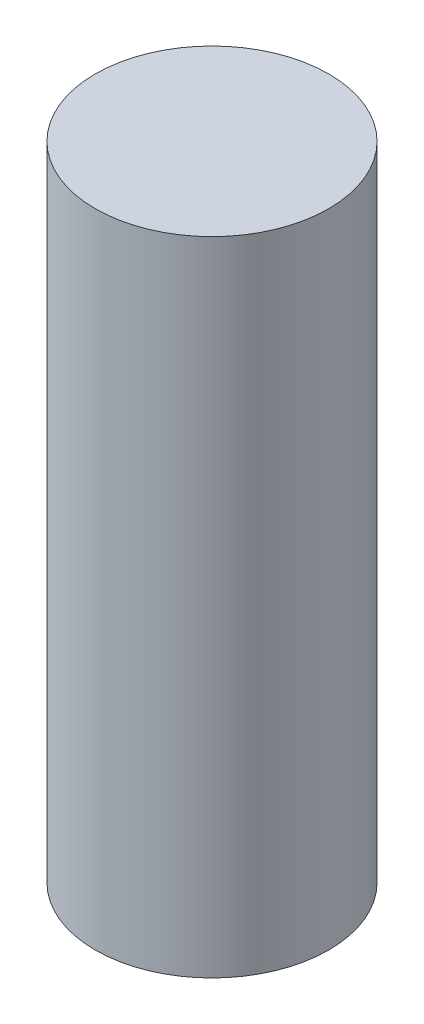
ISO-10303-21;
HEADER;
FILE_DESCRIPTION(('STEP AP214'),'2;1');
FILE_NAME('part.step','',(''),(''),'','','');
FILE_SCHEMA(('AUTOMOTIVE_DESIGN { 1 0 10303 214 1 1 1 1 }'));
ENDSEC;
DATA;
#1=APPLICATION_CONTEXT('core data for automotive mechanical design processes');
#2=APPLICATION_PROTOCOL_DEFINITION('international standard','automotive_design',2000,#1);
#3=PRODUCT_CONTEXT('',#1,'mechanical');
#4=PRODUCT('Part','Part','',(#3));
#5=PRODUCT_RELATED_PRODUCT_CATEGORY('part','',(#4));
#6=PRODUCT_DEFINITION_FORMATION('','',#4);
#7=PRODUCT_DEFINITION_CONTEXT('part definition',#1,'design');
#8=PRODUCT_DEFINITION('design','',#6,#7);
#9=PRODUCT_DEFINITION_SHAPE('','',#8);
#10=(LENGTH_UNIT() NAMED_UNIT(*) SI_UNIT(.MILLI.,.METRE.));
#11=(NAMED_UNIT(*) PLANE_ANGLE_UNIT() SI_UNIT($,.RADIAN.));
#12=(NAMED_UNIT(*) SI_UNIT($,.STERADIAN.) SOLID_ANGLE_UNIT());
#13=UNCERTAINTY_MEASURE_WITH_UNIT(LENGTH_MEASURE(1.E-05),#10,'distance_accuracy_value','');
#14=(GEOMETRIC_REPRESENTATION_CONTEXT(3) GLOBAL_UNCERTAINTY_ASSIGNED_CONTEXT((#13)) GLOBAL_UNIT_ASSIGNED_CONTEXT((#10,
#11,#12)) REPRESENTATION_CONTEXT('',''));
#15=CARTESIAN_POINT('',(0.,0.,0.));
#16=DIRECTION('',(0.,0.,1.));
#17=DIRECTION('',(1.,0.,0.));
#18=AXIS2_PLACEMENT_3D('',#15,#16,#17);
#19=CARTESIAN_POINT('',(0.,111.76,0.));
#20=DIRECTION('',(0.,-1.,0.));
#21=DIRECTION('',(0.,0.,-1.));
#22=AXIS2_PLACEMENT_3D('',#19,#20,#21);
#23=CYLINDRICAL_SURFACE('',#22,20.32);
#24=CARTESIAN_POINT('',(0.,111.76,0.));
#25=DIRECTION('',(0.,1.,0.));
#26=DIRECTION('',(0.,0.,1.));
#27=AXIS2_PLACEMENT_3D('',#24,#25,#26);
#28=CIRCLE('',#27,20.32);
#29=CARTESIAN_POINT('',(0.,111.76,20.32));
#30=VERTEX_POINT('',#29);
#31=EDGE_CURVE('E10',#30,#30,#28,.T.);
#32=ORIENTED_EDGE('',*,*,#31,.F.);
#33=EDGE_LOOP('',(#32));
#34=FACE_BOUND('',#33,.T.);
#35=CARTESIAN_POINT('',(0.,0.,0.));
#36=DIRECTION('',(0.,1.,0.));
#37=DIRECTION('',(0.,0.,1.));
#38=AXIS2_PLACEMENT_3D('',#35,#36,#37);
#39=CIRCLE('',#38,20.32);
#40=CARTESIAN_POINT('',(0.,0.,20.32));
#41=VERTEX_POINT('',#40);
#42=EDGE_CURVE('E40',#41,#41,#39,.T.);
#43=ORIENTED_EDGE('',*,*,#42,.T.);
#44=EDGE_LOOP('',(#43));
#45=FACE_BOUND('',#44,.T.);
#46=ADVANCED_FACE('F37',(#34,#45),#23,.T.);
#47=CARTESIAN_POINT('',(0.,111.76,0.));
#48=DIRECTION('',(0.,1.,0.));
#49=DIRECTION('',(0.,0.,1.));
#50=AXIS2_PLACEMENT_3D('',#47,#48,#49);
#51=PLANE('',#50);
#52=ORIENTED_EDGE('',*,*,#31,.T.);
#53=EDGE_LOOP('',(#52));
#54=FACE_BOUND('',#53,.T.);
#55=ADVANCED_FACE('F54',(#54),#51,.T.);
#56=CARTESIAN_POINT('',(0.,0.,0.));
#57=DIRECTION('',(0.,1.,0.));
#58=DIRECTION('',(0.,0.,1.));
#59=AXIS2_PLACEMENT_3D('',#56,#57,#58);
#60=PLANE('',#59);
#61=ORIENTED_EDGE('',*,*,#42,.F.);
#62=EDGE_LOOP('',(#61));
#63=FACE_BOUND('',#62,.T.);
#64=ADVANCED_FACE('F52',(#63),#60,.F.);
#65=CLOSED_SHELL('',(#46,#55,#64));
#66=MANIFOLD_SOLID_BREP('B2',#65);
#67=ADVANCED_BREP_SHAPE_REPRESENTATION('',(#18,#66),#14);
#68=SHAPE_DEFINITION_REPRESENTATION(#9,#67);
ENDSEC;
END-ISO-10303-21;
